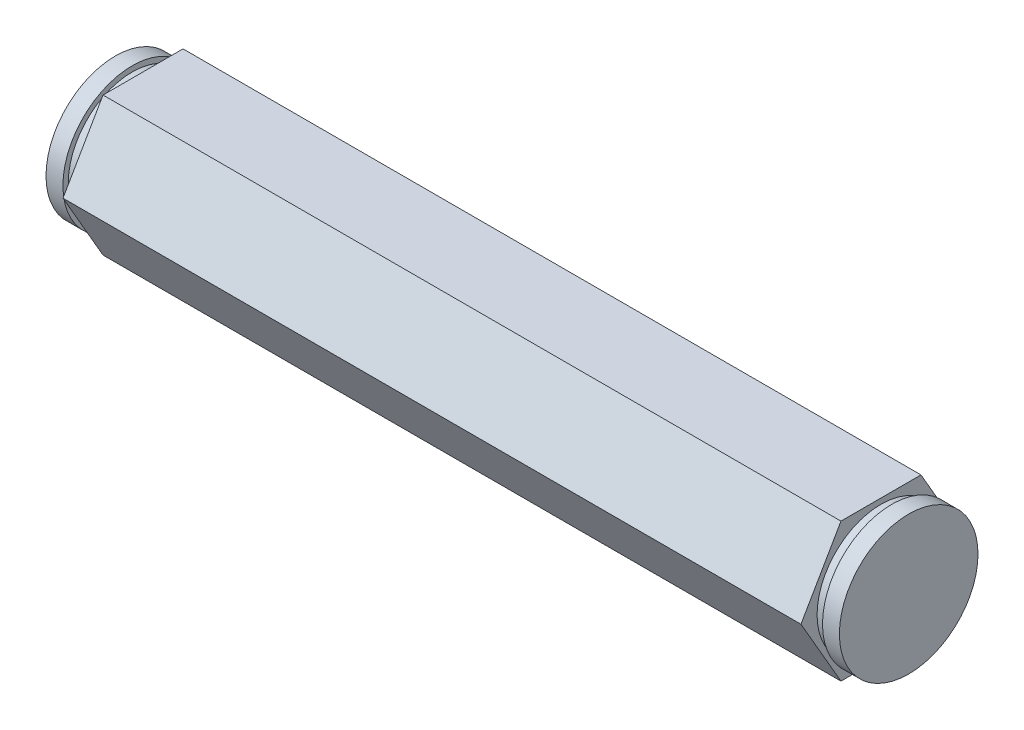
ISO-10303-21;
HEADER;
FILE_DESCRIPTION(('STEP AP214'),'2;1');
FILE_NAME('part.step','',(''),(''),'','','');
FILE_SCHEMA(('AUTOMOTIVE_DESIGN { 1 0 10303 214 1 1 1 1 }'));
ENDSEC;
DATA;
#1=APPLICATION_CONTEXT('core data for automotive mechanical design processes');
#2=APPLICATION_PROTOCOL_DEFINITION('international standard','automotive_design',2000,#1);
#3=PRODUCT_CONTEXT('',#1,'mechanical');
#4=PRODUCT('Part','Part','',(#3));
#5=PRODUCT_RELATED_PRODUCT_CATEGORY('part','',(#4));
#6=PRODUCT_DEFINITION_FORMATION('','',#4);
#7=PRODUCT_DEFINITION_CONTEXT('part definition',#1,'design');
#8=PRODUCT_DEFINITION('design','',#6,#7);
#9=PRODUCT_DEFINITION_SHAPE('','',#8);
#10=(LENGTH_UNIT() NAMED_UNIT(*) SI_UNIT(.MILLI.,.METRE.));
#11=(NAMED_UNIT(*) PLANE_ANGLE_UNIT() SI_UNIT($,.RADIAN.));
#12=(NAMED_UNIT(*) SI_UNIT($,.STERADIAN.) SOLID_ANGLE_UNIT());
#13=UNCERTAINTY_MEASURE_WITH_UNIT(LENGTH_MEASURE(1.E-05),#10,'distance_accuracy_value','');
#14=(GEOMETRIC_REPRESENTATION_CONTEXT(3) GLOBAL_UNCERTAINTY_ASSIGNED_CONTEXT((#13)) GLOBAL_UNIT_ASSIGNED_CONTEXT((#10,
#11,#12)) REPRESENTATION_CONTEXT('',''));
#15=CARTESIAN_POINT('',(0.,0.,0.));
#16=DIRECTION('',(0.,0.,1.));
#17=DIRECTION('',(1.,0.,0.));
#18=AXIS2_PLACEMENT_3D('',#15,#16,#17);
#19=CARTESIAN_POINT('',(36.34875001,-6.34999999999993,-3.66617420935418));
#20=DIRECTION('',(0.,0.499999999999995,0.866025403784442));
#21=DIRECTION('',(0.,-0.866025403784442,0.499999999999995));
#22=AXIS2_PLACEMENT_3D('',#19,#20,#21);
#23=PLANE('',#22);
#24=DIRECTION('',(-1.,0.,0.));
#25=VECTOR('',#24,1.);
#26=CARTESIAN_POINT('',(36.34875001,-6.34999999999993,-3.66617420935418));
#27=LINE('',#26,#25);
#28=CARTESIAN_POINT('',(33.80875001,-6.34999999999993,-3.66617420935418));
#29=VERTEX_POINT('',#28);
#30=CARTESIAN_POINT('',(-33.80875001,-6.34999999999993,-3.66617420935418));
#31=VERTEX_POINT('',#30);
#32=EDGE_CURVE('E114',#29,#31,#27,.T.);
#33=ORIENTED_EDGE('',*,*,#32,.T.);
#34=DIRECTION('',(0.,0.866025403784442,-0.499999999999995));
#35=VECTOR('',#34,1.);
#36=CARTESIAN_POINT('',(-33.80875001,-6.34999999999993,-3.66617420935418));
#37=LINE('',#36,#35);
#38=CARTESIAN_POINT('',(-33.80875001,0.,-7.33234841870821));
#39=VERTEX_POINT('',#38);
#40=EDGE_CURVE('E58',#31,#39,#37,.T.);
#41=ORIENTED_EDGE('',*,*,#40,.T.);
#42=DIRECTION('',(-1.,0.,0.));
#43=VECTOR('',#42,1.);
#44=CARTESIAN_POINT('',(36.34875001,0.,-7.33234841870821));
#45=LINE('',#44,#43);
#46=CARTESIAN_POINT('',(33.80875001,0.,-7.33234841870821));
#47=VERTEX_POINT('',#46);
#48=EDGE_CURVE('E131',#47,#39,#45,.T.);
#49=ORIENTED_EDGE('',*,*,#48,.F.);
#50=DIRECTION('',(0.,-0.866025403784442,0.499999999999995));
#51=VECTOR('',#50,1.);
#52=CARTESIAN_POINT('',(33.80875001,-6.34999999999993,-3.66617420935418));
#53=LINE('',#52,#51);
#54=EDGE_CURVE('E120',#47,#29,#53,.T.);
#55=ORIENTED_EDGE('',*,*,#54,.T.);
#56=EDGE_LOOP('',(#33,#41,#49,#55));
#57=FACE_BOUND('',#56,.T.);
#58=ADVANCED_FACE('F43',(#57),#23,.F.);
#59=CARTESIAN_POINT('',(36.34875001,0.,-7.33234841870821));
#60=DIRECTION('',(0.,-0.500000000000001,0.866025403784438));
#61=DIRECTION('',(0.,-0.866025403784438,-0.500000000000001));
#62=AXIS2_PLACEMENT_3D('',#59,#60,#61);
#63=PLANE('',#62);
#64=ORIENTED_EDGE('',*,*,#48,.T.);
#65=DIRECTION('',(0.,0.866025403784438,0.500000000000001));
#66=VECTOR('',#65,1.);
#67=CARTESIAN_POINT('',(-33.80875001,0.,-7.33234841870821));
#68=LINE('',#67,#66);
#69=CARTESIAN_POINT('',(-33.80875001,6.34999999999998,-3.66617420935409));
#70=VERTEX_POINT('',#69);
#71=EDGE_CURVE('E171',#39,#70,#68,.T.);
#72=ORIENTED_EDGE('',*,*,#71,.T.);
#73=DIRECTION('',(-1.,0.,0.));
#74=VECTOR('',#73,1.);
#75=CARTESIAN_POINT('',(36.34875001,6.34999999999998,-3.66617420935409));
#76=LINE('',#75,#74);
#77=CARTESIAN_POINT('',(33.80875001,6.34999999999998,-3.66617420935409));
#78=VERTEX_POINT('',#77);
#79=EDGE_CURVE('E127',#78,#70,#76,.T.);
#80=ORIENTED_EDGE('',*,*,#79,.F.);
#81=DIRECTION('',(0.,-0.866025403784438,-0.500000000000001));
#82=VECTOR('',#81,1.);
#83=CARTESIAN_POINT('',(33.80875001,0.,-7.33234841870821));
#84=LINE('',#83,#82);
#85=EDGE_CURVE('E199',#78,#47,#84,.T.);
#86=ORIENTED_EDGE('',*,*,#85,.T.);
#87=EDGE_LOOP('',(#64,#72,#80,#86));
#88=FACE_BOUND('',#87,.T.);
#89=ADVANCED_FACE('F209',(#88),#63,.F.);
#90=CARTESIAN_POINT('',(36.34875001,6.34999999999998,-3.66617420935409));
#91=DIRECTION('',(0.,-1.,0.));
#92=DIRECTION('',(0.,0.,-1.));
#93=AXIS2_PLACEMENT_3D('',#90,#91,#92);
#94=PLANE('',#93);
#95=ORIENTED_EDGE('',*,*,#79,.T.);
#96=DIRECTION('',(0.,0.,1.));
#97=VECTOR('',#96,1.);
#98=CARTESIAN_POINT('',(-33.80875001,6.34999999999998,-3.66617420935409));
#99=LINE('',#98,#97);
#100=CARTESIAN_POINT('',(-33.80875001,6.34999999999995,3.66617420935414));
#101=VERTEX_POINT('',#100);
#102=EDGE_CURVE('E167',#70,#101,#99,.T.);
#103=ORIENTED_EDGE('',*,*,#102,.T.);
#104=DIRECTION('',(-1.,0.,0.));
#105=VECTOR('',#104,1.);
#106=CARTESIAN_POINT('',(36.34875001,6.34999999999995,3.66617420935414));
#107=LINE('',#106,#105);
#108=CARTESIAN_POINT('',(33.80875001,6.34999999999995,3.66617420935414));
#109=VERTEX_POINT('',#108);
#110=EDGE_CURVE('E118',#109,#101,#107,.T.);
#111=ORIENTED_EDGE('',*,*,#110,.F.);
#112=DIRECTION('',(0.,0.,-1.));
#113=VECTOR('',#112,1.);
#114=CARTESIAN_POINT('',(33.80875001,6.34999999999998,-3.66617420935409));
#115=LINE('',#114,#113);
#116=EDGE_CURVE('E195',#109,#78,#115,.T.);
#117=ORIENTED_EDGE('',*,*,#116,.T.);
#118=EDGE_LOOP('',(#95,#103,#111,#117));
#119=FACE_BOUND('',#118,.T.);
#120=ADVANCED_FACE('F211',(#119),#94,.F.);
#121=CARTESIAN_POINT('',(36.34875001,6.34999999999995,3.66617420935414));
#122=DIRECTION('',(0.,-0.499999999999995,-0.866025403784442));
#123=DIRECTION('',(0.,0.866025403784442,-0.499999999999995));
#124=AXIS2_PLACEMENT_3D('',#121,#122,#123);
#125=PLANE('',#124);
#126=ORIENTED_EDGE('',*,*,#110,.T.);
#127=DIRECTION('',(0.,-0.866025403784442,0.499999999999995));
#128=VECTOR('',#127,1.);
#129=CARTESIAN_POINT('',(-33.80875001,6.34999999999995,3.66617420935414));
#130=LINE('',#129,#128);
#131=CARTESIAN_POINT('',(-33.80875001,0.,7.33234841870821));
#132=VERTEX_POINT('',#131);
#133=EDGE_CURVE('E108',#101,#132,#130,.T.);
#134=ORIENTED_EDGE('',*,*,#133,.T.);
#135=DIRECTION('',(-1.,0.,0.));
#136=VECTOR('',#135,1.);
#137=CARTESIAN_POINT('',(36.34875001,0.,7.33234841870821));
#138=LINE('',#137,#136);
#139=CARTESIAN_POINT('',(33.80875001,0.,7.33234841870821));
#140=VERTEX_POINT('',#139);
#141=EDGE_CURVE('E106',#140,#132,#138,.T.);
#142=ORIENTED_EDGE('',*,*,#141,.F.);
#143=DIRECTION('',(0.,0.866025403784442,-0.499999999999995));
#144=VECTOR('',#143,1.);
#145=CARTESIAN_POINT('',(33.80875001,6.34999999999995,3.66617420935414));
#146=LINE('',#145,#144);
#147=EDGE_CURVE('E191',#140,#109,#146,.T.);
#148=ORIENTED_EDGE('',*,*,#147,.T.);
#149=EDGE_LOOP('',(#126,#134,#142,#148));
#150=FACE_BOUND('',#149,.T.);
#151=ADVANCED_FACE('F214',(#150),#125,.F.);
#152=CARTESIAN_POINT('',(36.34875001,0.,7.33234841870821));
#153=DIRECTION('',(0.,0.500000000000007,-0.866025403784434));
#154=DIRECTION('',(0.,0.866025403784435,0.500000000000007));
#155=AXIS2_PLACEMENT_3D('',#152,#153,#154);
#156=PLANE('',#155);
#157=ORIENTED_EDGE('',*,*,#141,.T.);
#158=DIRECTION('',(0.,-0.866025403784435,-0.500000000000007));
#159=VECTOR('',#158,1.);
#160=CARTESIAN_POINT('',(-33.80875001,0.,7.33234841870821));
#161=LINE('',#160,#159);
#162=CARTESIAN_POINT('',(-33.80875001,-6.35,3.66617420935405));
#163=VERTEX_POINT('',#162);
#164=EDGE_CURVE('E94',#132,#163,#161,.T.);
#165=ORIENTED_EDGE('',*,*,#164,.T.);
#166=DIRECTION('',(-1.,0.,0.));
#167=VECTOR('',#166,1.);
#168=CARTESIAN_POINT('',(36.34875001,-6.35,3.66617420935405));
#169=LINE('',#168,#167);
#170=CARTESIAN_POINT('',(33.80875001,-6.35,3.66617420935405));
#171=VERTEX_POINT('',#170);
#172=EDGE_CURVE('E104',#171,#163,#169,.T.);
#173=ORIENTED_EDGE('',*,*,#172,.F.);
#174=DIRECTION('',(0.,0.866025403784435,0.500000000000007));
#175=VECTOR('',#174,1.);
#176=CARTESIAN_POINT('',(33.80875001,0.,7.33234841870821));
#177=LINE('',#176,#175);
#178=EDGE_CURVE('E65',#171,#140,#177,.T.);
#179=ORIENTED_EDGE('',*,*,#178,.T.);
#180=EDGE_LOOP('',(#157,#165,#173,#179));
#181=FACE_BOUND('',#180,.T.);
#182=ADVANCED_FACE('F103',(#181),#156,.F.);
#183=CARTESIAN_POINT('',(36.34875001,-6.35,3.66617420935405));
#184=DIRECTION('',(0.,1.,0.));
#185=DIRECTION('',(0.,0.,1.));
#186=AXIS2_PLACEMENT_3D('',#183,#184,#185);
#187=PLANE('',#186);
#188=ORIENTED_EDGE('',*,*,#172,.T.);
#189=DIRECTION('',(0.,0.,-1.));
#190=VECTOR('',#189,1.);
#191=CARTESIAN_POINT('',(-33.80875001,-6.35,3.66617420935405));
#192=LINE('',#191,#190);
#193=EDGE_CURVE('E11',#163,#31,#192,.T.);
#194=ORIENTED_EDGE('',*,*,#193,.T.);
#195=ORIENTED_EDGE('',*,*,#32,.F.);
#196=DIRECTION('',(0.,0.,1.));
#197=VECTOR('',#196,1.);
#198=CARTESIAN_POINT('',(33.80875001,-6.35,3.66617420935405));
#199=LINE('',#198,#197);
#200=EDGE_CURVE('E112',#29,#171,#199,.T.);
#201=ORIENTED_EDGE('',*,*,#200,.T.);
#202=EDGE_LOOP('',(#188,#194,#195,#201));
#203=FACE_BOUND('',#202,.T.);
#204=ADVANCED_FACE('F111',(#203),#187,.F.);
#205=CARTESIAN_POINT('',(33.80875001,0.,8.89));
#206=DIRECTION('',(-1.,0.,0.));
#207=DIRECTION('',(0.,0.,1.));
#208=AXIS2_PLACEMENT_3D('',#205,#206,#207);
#209=PLANE('',#208);
#210=CARTESIAN_POINT('',(33.80875001,0.,0.));
#211=DIRECTION('',(-1.,0.,0.));
#212=DIRECTION('',(0.,0.,1.));
#213=AXIS2_PLACEMENT_3D('',#210,#211,#212);
#214=CIRCLE('',#213,5.8547);
#215=CARTESIAN_POINT('',(33.80875001,0.,5.8547));
#216=VERTEX_POINT('',#215);
#217=EDGE_CURVE('E185',#216,#216,#214,.T.);
#218=ORIENTED_EDGE('',*,*,#217,.T.);
#219=EDGE_LOOP('',(#218));
#220=FACE_BOUND('',#219,.T.);
#221=ORIENTED_EDGE('',*,*,#85,.F.);
#222=ORIENTED_EDGE('',*,*,#116,.F.);
#223=ORIENTED_EDGE('',*,*,#147,.F.);
#224=ORIENTED_EDGE('',*,*,#178,.F.);
#225=ORIENTED_EDGE('',*,*,#200,.F.);
#226=ORIENTED_EDGE('',*,*,#54,.F.);
#227=EDGE_LOOP('',(#221,#222,#223,#224,#225,#226));
#228=FACE_BOUND('',#227,.T.);
#229=ADVANCED_FACE('F206',(#220,#228),#209,.F.);
#230=CARTESIAN_POINT('',(0.,0.,0.));
#231=DIRECTION('',(-1.,0.,0.));
#232=DIRECTION('',(0.,0.,1.));
#233=AXIS2_PLACEMENT_3D('',#230,#231,#232);
#234=CYLINDRICAL_SURFACE('',#233,6.35);
#235=CARTESIAN_POINT('',(36.34875001,0.,0.));
#236=DIRECTION('',(1.,0.,0.));
#237=DIRECTION('',(0.,0.,-1.));
#238=AXIS2_PLACEMENT_3D('',#235,#236,#237);
#239=CIRCLE('',#238,6.35);
#240=CARTESIAN_POINT('',(36.34875001,0.,-6.35));
#241=VERTEX_POINT('',#240);
#242=EDGE_CURVE('E135',#241,#241,#239,.F.);
#243=ORIENTED_EDGE('',*,*,#242,.T.);
#244=EDGE_LOOP('',(#243));
#245=FACE_BOUND('',#244,.T.);
#246=CARTESIAN_POINT('',(34.79935001,0.,0.));
#247=DIRECTION('',(-1.,0.,0.));
#248=DIRECTION('',(0.,0.,1.));
#249=AXIS2_PLACEMENT_3D('',#246,#247,#248);
#250=CIRCLE('',#249,6.35);
#251=CARTESIAN_POINT('',(34.79935001,0.,6.35));
#252=VERTEX_POINT('',#251);
#253=EDGE_CURVE('E177',#252,#252,#250,.T.);
#254=ORIENTED_EDGE('',*,*,#253,.F.);
#255=EDGE_LOOP('',(#254));
#256=FACE_BOUND('',#255,.T.);
#257=ADVANCED_FACE('F331',(#245,#256),#234,.T.);
#258=CARTESIAN_POINT('',(0.,0.,0.));
#259=DIRECTION('',(-1.,0.,0.));
#260=DIRECTION('',(0.,0.,1.));
#261=AXIS2_PLACEMENT_3D('',#258,#259,#260);
#262=CYLINDRICAL_SURFACE('',#261,5.8547);
#263=ORIENTED_EDGE('',*,*,#217,.F.);
#264=EDGE_LOOP('',(#263));
#265=FACE_BOUND('',#264,.T.);
#266=CARTESIAN_POINT('',(34.79935001,0.,0.));
#267=DIRECTION('',(-1.,0.,0.));
#268=DIRECTION('',(0.,0.,1.));
#269=AXIS2_PLACEMENT_3D('',#266,#267,#268);
#270=CIRCLE('',#269,5.8547);
#271=CARTESIAN_POINT('',(34.79935001,0.,5.8547));
#272=VERTEX_POINT('',#271);
#273=EDGE_CURVE('E181',#272,#272,#270,.T.);
#274=ORIENTED_EDGE('',*,*,#273,.T.);
#275=EDGE_LOOP('',(#274));
#276=FACE_BOUND('',#275,.T.);
#277=ADVANCED_FACE('F319',(#265,#276),#262,.T.);
#278=CARTESIAN_POINT('',(34.79935001,0.,5.8547));
#279=DIRECTION('',(1.,0.,0.));
#280=DIRECTION('',(0.,0.,-1.));
#281=AXIS2_PLACEMENT_3D('',#278,#279,#280);
#282=PLANE('',#281);
#283=ORIENTED_EDGE('',*,*,#273,.F.);
#284=EDGE_LOOP('',(#283));
#285=FACE_BOUND('',#284,.T.);
#286=ORIENTED_EDGE('',*,*,#253,.T.);
#287=EDGE_LOOP('',(#286));
#288=FACE_BOUND('',#287,.T.);
#289=ADVANCED_FACE('F313',(#285,#288),#282,.F.);
#290=CARTESIAN_POINT('',(36.34875001,0.,0.));
#291=DIRECTION('',(1.,0.,0.));
#292=DIRECTION('',(0.,0.,-1.));
#293=AXIS2_PLACEMENT_3D('',#290,#291,#292);
#294=PLANE('',#293);
#295=ORIENTED_EDGE('',*,*,#242,.F.);
#296=EDGE_LOOP('',(#295));
#297=FACE_BOUND('',#296,.T.);
#298=ADVANCED_FACE('F266',(#297),#294,.T.);
#299=CARTESIAN_POINT('',(-33.80875001,0.,8.89));
#300=DIRECTION('',(1.,0.,0.));
#301=DIRECTION('',(0.,0.,1.));
#302=AXIS2_PLACEMENT_3D('',#299,#300,#301);
#303=PLANE('',#302);
#304=CARTESIAN_POINT('',(-33.80875001,0.,0.));
#305=DIRECTION('',(-1.,0.,0.));
#306=DIRECTION('',(0.,0.,1.));
#307=AXIS2_PLACEMENT_3D('',#304,#305,#306);
#308=CIRCLE('',#307,5.8547);
#309=CARTESIAN_POINT('',(-33.80875001,0.,5.8547));
#310=VERTEX_POINT('',#309);
#311=EDGE_CURVE('E109',#310,#310,#308,.T.);
#312=ORIENTED_EDGE('',*,*,#311,.F.);
#313=EDGE_LOOP('',(#312));
#314=FACE_BOUND('',#313,.T.);
#315=ORIENTED_EDGE('',*,*,#193,.F.);
#316=ORIENTED_EDGE('',*,*,#164,.F.);
#317=ORIENTED_EDGE('',*,*,#133,.F.);
#318=ORIENTED_EDGE('',*,*,#102,.F.);
#319=ORIENTED_EDGE('',*,*,#71,.F.);
#320=ORIENTED_EDGE('',*,*,#40,.F.);
#321=EDGE_LOOP('',(#315,#316,#317,#318,#319,#320));
#322=FACE_BOUND('',#321,.T.);
#323=ADVANCED_FACE('F93',(#314,#322),#303,.F.);
#324=CARTESIAN_POINT('',(0.,0.,0.));
#325=DIRECTION('',(1.,0.,0.));
#326=DIRECTION('',(0.,0.,1.));
#327=AXIS2_PLACEMENT_3D('',#324,#325,#326);
#328=CYLINDRICAL_SURFACE('',#327,6.35);
#329=CARTESIAN_POINT('',(-36.34875001,0.,0.));
#330=DIRECTION('',(1.,0.,0.));
#331=DIRECTION('',(0.,0.,-1.));
#332=AXIS2_PLACEMENT_3D('',#329,#330,#331);
#333=CIRCLE('',#332,6.35);
#334=CARTESIAN_POINT('',(-36.34875001,0.,-6.35));
#335=VERTEX_POINT('',#334);
#336=EDGE_CURVE('E51',#335,#335,#333,.F.);
#337=ORIENTED_EDGE('',*,*,#336,.F.);
#338=EDGE_LOOP('',(#337));
#339=FACE_BOUND('',#338,.T.);
#340=CARTESIAN_POINT('',(-34.79935001,0.,0.));
#341=DIRECTION('',(-1.,0.,0.));
#342=DIRECTION('',(0.,0.,1.));
#343=AXIS2_PLACEMENT_3D('',#340,#341,#342);
#344=CIRCLE('',#343,6.35);
#345=CARTESIAN_POINT('',(-34.79935001,0.,6.35));
#346=VERTEX_POINT('',#345);
#347=EDGE_CURVE('E153',#346,#346,#344,.T.);
#348=ORIENTED_EDGE('',*,*,#347,.T.);
#349=EDGE_LOOP('',(#348));
#350=FACE_BOUND('',#349,.T.);
#351=ADVANCED_FACE('F146',(#339,#350),#328,.T.);
#352=CARTESIAN_POINT('',(0.,0.,0.));
#353=DIRECTION('',(1.,0.,0.));
#354=DIRECTION('',(0.,0.,1.));
#355=AXIS2_PLACEMENT_3D('',#352,#353,#354);
#356=CYLINDRICAL_SURFACE('',#355,5.8547);
#357=ORIENTED_EDGE('',*,*,#311,.T.);
#358=EDGE_LOOP('',(#357));
#359=FACE_BOUND('',#358,.T.);
#360=CARTESIAN_POINT('',(-34.79935001,0.,0.));
#361=DIRECTION('',(-1.,0.,0.));
#362=DIRECTION('',(0.,0.,1.));
#363=AXIS2_PLACEMENT_3D('',#360,#361,#362);
#364=CIRCLE('',#363,5.8547);
#365=CARTESIAN_POINT('',(-34.79935001,0.,5.8547));
#366=VERTEX_POINT('',#365);
#367=EDGE_CURVE('E156',#366,#366,#364,.T.);
#368=ORIENTED_EDGE('',*,*,#367,.F.);
#369=EDGE_LOOP('',(#368));
#370=FACE_BOUND('',#369,.T.);
#371=ADVANCED_FACE('F149',(#359,#370),#356,.T.);
#372=CARTESIAN_POINT('',(-34.79935001,0.,5.8547));
#373=DIRECTION('',(-1.,0.,0.));
#374=DIRECTION('',(0.,0.,-1.));
#375=AXIS2_PLACEMENT_3D('',#372,#373,#374);
#376=PLANE('',#375);
#377=ORIENTED_EDGE('',*,*,#367,.T.);
#378=EDGE_LOOP('',(#377));
#379=FACE_BOUND('',#378,.T.);
#380=ORIENTED_EDGE('',*,*,#347,.F.);
#381=EDGE_LOOP('',(#380));
#382=FACE_BOUND('',#381,.T.);
#383=ADVANCED_FACE('F286',(#379,#382),#376,.F.);
#384=CARTESIAN_POINT('',(-36.34875001,0.,0.));
#385=DIRECTION('',(1.,0.,0.));
#386=DIRECTION('',(0.,0.,-1.));
#387=AXIS2_PLACEMENT_3D('',#384,#385,#386);
#388=PLANE('',#387);
#389=ORIENTED_EDGE('',*,*,#336,.T.);
#390=EDGE_LOOP('',(#389));
#391=FACE_BOUND('',#390,.T.);
#392=ADVANCED_FACE('F144',(#391),#388,.F.);
#393=CLOSED_SHELL('',(#58,#89,#120,#151,#182,#204,#229,#257,#277,#289,#298,#323,#351,#371,#383,#392));
#394=MANIFOLD_SOLID_BREP('B2',#393);
#395=ADVANCED_BREP_SHAPE_REPRESENTATION('',(#18,#394),#14);
#396=SHAPE_DEFINITION_REPRESENTATION(#9,#395);
ENDSEC;
END-ISO-10303-21;
